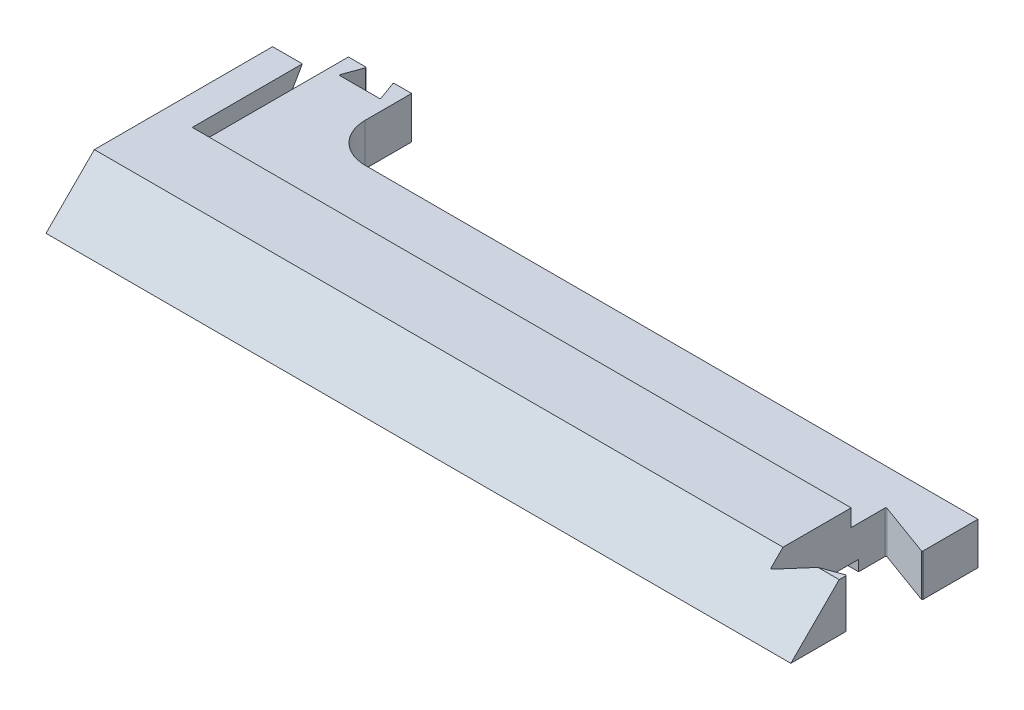
ISO-10303-21;
HEADER;
FILE_DESCRIPTION(('STEP AP214'),'2;1');
FILE_NAME('part.step','',(''),(''),'','','');
FILE_SCHEMA(('AUTOMOTIVE_DESIGN { 1 0 10303 214 1 1 1 1 }'));
ENDSEC;
DATA;
#1=APPLICATION_CONTEXT('core data for automotive mechanical design processes');
#2=APPLICATION_PROTOCOL_DEFINITION('international standard','automotive_design',2000,#1);
#3=PRODUCT_CONTEXT('',#1,'mechanical');
#4=PRODUCT('Part','Part','',(#3));
#5=PRODUCT_RELATED_PRODUCT_CATEGORY('part','',(#4));
#6=PRODUCT_DEFINITION_FORMATION('','',#4);
#7=PRODUCT_DEFINITION_CONTEXT('part definition',#1,'design');
#8=PRODUCT_DEFINITION('design','',#6,#7);
#9=PRODUCT_DEFINITION_SHAPE('','',#8);
#10=(LENGTH_UNIT() NAMED_UNIT(*) SI_UNIT(.MILLI.,.METRE.));
#11=(NAMED_UNIT(*) PLANE_ANGLE_UNIT() SI_UNIT($,.RADIAN.));
#12=(NAMED_UNIT(*) SI_UNIT($,.STERADIAN.) SOLID_ANGLE_UNIT());
#13=UNCERTAINTY_MEASURE_WITH_UNIT(LENGTH_MEASURE(1.E-05),#10,'distance_accuracy_value','');
#14=(GEOMETRIC_REPRESENTATION_CONTEXT(3) GLOBAL_UNCERTAINTY_ASSIGNED_CONTEXT((#13)) GLOBAL_UNIT_ASSIGNED_CONTEXT((#10,
#11,#12)) REPRESENTATION_CONTEXT('',''));
#15=CARTESIAN_POINT('',(0.,0.,0.));
#16=DIRECTION('',(0.,0.,1.));
#17=DIRECTION('',(1.,0.,0.));
#18=AXIS2_PLACEMENT_3D('',#15,#16,#17);
#19=CARTESIAN_POINT('',(-192.3375,0.,0.));
#20=DIRECTION('',(-1.,0.,0.));
#21=DIRECTION('',(0.,0.,1.));
#22=AXIS2_PLACEMENT_3D('',#19,#20,#21);
#23=PLANE('',#22);
#24=DIRECTION('',(0.,0.,1.));
#25=VECTOR('',#24,1.);
#26=CARTESIAN_POINT('',(-192.3375,11.31,-330.275));
#27=LINE('',#26,#25);
#28=CARTESIAN_POINT('',(-192.3375,11.31,-17.));
#29=VERTEX_POINT('',#28);
#30=CARTESIAN_POINT('',(-192.3375,11.31,-2.21687960134842));
#31=VERTEX_POINT('',#30);
#32=EDGE_CURVE('E290',#29,#31,#27,.T.);
#33=ORIENTED_EDGE('',*,*,#32,.T.);
#34=DIRECTION('',(0.,1.,0.));
#35=VECTOR('',#34,1.);
#36=CARTESIAN_POINT('',(-192.3375,0.,-2.2168796013484));
#37=LINE('',#36,#35);
#38=CARTESIAN_POINT('',(-192.3375,0.,-2.21687960134842));
#39=VERTEX_POINT('',#38);
#40=EDGE_CURVE('E59',#31,#39,#37,.F.);
#41=ORIENTED_EDGE('',*,*,#40,.T.);
#42=DIRECTION('',(0.,0.,1.));
#43=VECTOR('',#42,1.);
#44=CARTESIAN_POINT('',(-192.3375,0.,-330.275));
#45=LINE('',#44,#43);
#46=CARTESIAN_POINT('',(-192.3375,0.,-17.));
#47=VERTEX_POINT('',#46);
#48=EDGE_CURVE('E305',#47,#39,#45,.T.);
#49=ORIENTED_EDGE('',*,*,#48,.F.);
#50=DIRECTION('',(0.,1.,0.));
#51=VECTOR('',#50,1.);
#52=CARTESIAN_POINT('',(-192.3375,2.9,-17.));
#53=LINE('',#52,#51);
#54=EDGE_CURVE('E294',#47,#29,#53,.T.);
#55=ORIENTED_EDGE('',*,*,#54,.T.);
#56=EDGE_LOOP('',(#33,#41,#49,#55));
#57=FACE_BOUND('',#56,.T.);
#58=ADVANCED_FACE('F44',(#57),#23,.F.);
#59=CARTESIAN_POINT('',(0.,15.9,0.));
#60=DIRECTION('',(0.,1.,0.));
#61=DIRECTION('',(0.,0.,1.));
#62=AXIS2_PLACEMENT_3D('',#59,#60,#61);
#63=PLANE('',#62);
#64=DIRECTION('',(0.,0.,1.));
#65=VECTOR('',#64,1.);
#66=CARTESIAN_POINT('',(-192.3375,15.9,0.));
#67=LINE('',#66,#65);
#68=CARTESIAN_POINT('',(-192.3375,15.9,18.5543796013485));
#69=VERTEX_POINT('',#68);
#70=CARTESIAN_POINT('',(-192.3375,15.9,20.3375000000002));
#71=VERTEX_POINT('',#70);
#72=EDGE_CURVE('E299',#69,#71,#67,.T.);
#73=ORIENTED_EDGE('',*,*,#72,.F.);
#74=CARTESIAN_POINT('',(-192.5375,15.9,18.5543796013485));
#75=DIRECTION('',(0.,1.,0.));
#76=DIRECTION('',(0.,0.,1.));
#77=AXIS2_PLACEMENT_3D('',#74,#75,#76);
#78=CIRCLE('',#77,0.2);
#79=CARTESIAN_POINT('',(-192.605904028665,15.9,18.3664410771913));
#80=VERTEX_POINT('',#79);
#81=EDGE_CURVE('E355',#69,#80,#78,.T.);
#82=ORIENTED_EDGE('',*,*,#81,.T.);
#83=DIRECTION('',(0.939692620785909,0.,-0.342020143325666));
#84=VECTOR('',#83,1.);
#85=CARTESIAN_POINT('',(-16.627750388571,15.9,-45.684368728927));
#86=LINE('',#85,#84);
#87=CARTESIAN_POINT('',(-198.021343911497,15.9,20.3375000000002));
#88=VERTEX_POINT('',#87);
#89=EDGE_CURVE('E392',#88,#80,#86,.T.);
#90=ORIENTED_EDGE('',*,*,#89,.F.);
#91=DIRECTION('',(1.,0.,0.));
#92=VECTOR('',#91,1.);
#93=CARTESIAN_POINT('',(-392.675,15.9,20.3375000000002));
#94=LINE('',#93,#92);
#95=EDGE_CURVE('E425',#88,#71,#94,.T.);
#96=ORIENTED_EDGE('',*,*,#95,.T.);
#97=EDGE_LOOP('',(#73,#82,#90,#96));
#98=FACE_BOUND('',#97,.T.);
#99=ADVANCED_FACE('F508',(#98),#63,.T.);
#100=CARTESIAN_POINT('',(0.,0.,-40.));
#101=DIRECTION('',(0.,0.,1.));
#102=DIRECTION('',(1.,0.,0.));
#103=AXIS2_PLACEMENT_3D('',#100,#101,#102);
#104=PLANE('',#103);
#105=DIRECTION('',(1.,0.,0.));
#106=VECTOR('',#105,1.);
#107=CARTESIAN_POINT('',(-357.675,0.,-40.));
#108=LINE('',#107,#106);
#109=CARTESIAN_POINT('',(-372.289370398652,0.,-40.));
#110=VERTEX_POINT('',#109);
#111=CARTESIAN_POINT('',(-367.675,0.,-40.));
#112=VERTEX_POINT('',#111);
#113=EDGE_CURVE('E304',#110,#112,#108,.T.);
#114=ORIENTED_EDGE('',*,*,#113,.F.);
#115=DIRECTION('',(0.,1.,0.));
#116=VECTOR('',#115,1.);
#117=CARTESIAN_POINT('',(-372.289370398652,0.,-40.));
#118=LINE('',#117,#116);
#119=CARTESIAN_POINT('',(-372.289370398652,11.31,-40.));
#120=VERTEX_POINT('',#119);
#121=EDGE_CURVE('E325',#110,#120,#118,.T.);
#122=ORIENTED_EDGE('',*,*,#121,.T.);
#123=DIRECTION('',(1.,0.,0.));
#124=VECTOR('',#123,1.);
#125=CARTESIAN_POINT('',(-357.675,11.31,-40.));
#126=LINE('',#125,#124);
#127=CARTESIAN_POINT('',(-367.675,11.31,-40.));
#128=VERTEX_POINT('',#127);
#129=EDGE_CURVE('E292',#120,#128,#126,.T.);
#130=ORIENTED_EDGE('',*,*,#129,.T.);
#131=DIRECTION('',(0.,-1.,0.));
#132=VECTOR('',#131,1.);
#133=CARTESIAN_POINT('',(-367.675,2.9,-40.));
#134=LINE('',#133,#132);
#135=EDGE_CURVE('E297',#128,#112,#134,.T.);
#136=ORIENTED_EDGE('',*,*,#135,.T.);
#137=EDGE_LOOP('',(#114,#122,#130,#136));
#138=FACE_BOUND('',#137,.T.);
#139=ADVANCED_FACE('F515',(#138),#104,.F.);
#140=CARTESIAN_POINT('',(-384.675,11.31,-40.));
#141=VERTEX_POINT('',#140);
#142=CARTESIAN_POINT('',(-380.060629601348,11.31,-40.));
#143=VERTEX_POINT('',#142);
#144=EDGE_CURVE('E298',#141,#143,#126,.T.);
#145=ORIENTED_EDGE('',*,*,#144,.T.);
#146=DIRECTION('',(0.,1.,0.));
#147=VECTOR('',#146,1.);
#148=CARTESIAN_POINT('',(-380.060629601348,0.,-40.));
#149=LINE('',#148,#147);
#150=CARTESIAN_POINT('',(-380.060629601348,0.,-40.));
#151=VERTEX_POINT('',#150);
#152=EDGE_CURVE('E341',#143,#151,#149,.F.);
#153=ORIENTED_EDGE('',*,*,#152,.T.);
#154=CARTESIAN_POINT('',(-384.675,0.,-40.));
#155=VERTEX_POINT('',#154);
#156=EDGE_CURVE('E307',#155,#151,#108,.T.);
#157=ORIENTED_EDGE('',*,*,#156,.F.);
#158=DIRECTION('',(0.,-1.,0.));
#159=VECTOR('',#158,1.);
#160=CARTESIAN_POINT('',(-384.675,2.9,-40.));
#161=LINE('',#160,#159);
#162=EDGE_CURVE('E301',#141,#155,#161,.T.);
#163=ORIENTED_EDGE('',*,*,#162,.F.);
#164=EDGE_LOOP('',(#145,#153,#157,#163));
#165=FACE_BOUND('',#164,.T.);
#166=ADVANCED_FACE('F523',(#165),#104,.F.);
#167=DIRECTION('',(0.,0.,1.));
#168=VECTOR('',#167,1.);
#169=CARTESIAN_POINT('',(-192.3375,2.9,0.));
#170=LINE('',#169,#168);
#171=CARTESIAN_POINT('',(-192.3375,2.9,18.5543796013485));
#172=VERTEX_POINT('',#171);
#173=CARTESIAN_POINT('',(-192.3375,2.9,33.3375));
#174=VERTEX_POINT('',#173);
#175=EDGE_CURVE('E302',#172,#174,#170,.T.);
#176=ORIENTED_EDGE('',*,*,#175,.F.);
#177=DIRECTION('',(0.,1.,0.));
#178=VECTOR('',#177,1.);
#179=CARTESIAN_POINT('',(-192.3375,0.,18.5543796013485));
#180=LINE('',#179,#178);
#181=EDGE_CURVE('E352',#172,#69,#180,.T.);
#182=ORIENTED_EDGE('',*,*,#181,.T.);
#183=ORIENTED_EDGE('',*,*,#72,.T.);
#184=DIRECTION('',(0.,0.707106781186551,-0.707106781186544));
#185=VECTOR('',#184,1.);
#186=CARTESIAN_POINT('',(-192.3375,2.89999999999999,33.3375000000001));
#187=LINE('',#186,#185);
#188=EDGE_CURVE('E289',#174,#71,#187,.T.);
#189=ORIENTED_EDGE('',*,*,#188,.F.);
#190=EDGE_LOOP('',(#176,#182,#183,#189));
#191=FACE_BOUND('',#190,.T.);
#192=ADVANCED_FACE('F510',(#191),#23,.F.);
#193=CARTESIAN_POINT('',(-384.675,2.9,-20.1093093456041));
#194=DIRECTION('',(0.,0.500000000000004,0.866025403784436));
#195=DIRECTION('',(0.,-0.866025403784436,0.500000000000004));
#196=AXIS2_PLACEMENT_3D('',#193,#194,#195);
#197=PLANE('',#196);
#198=DIRECTION('',(0.,0.866025403784436,-0.500000000000004));
#199=VECTOR('',#198,1.);
#200=CARTESIAN_POINT('',(-392.675,2.9,-20.1093093456041));
#201=LINE('',#200,#199);
#202=CARTESIAN_POINT('',(-392.675,2.9,-20.1093093456041));
#203=VERTEX_POINT('',#202);
#204=CARTESIAN_POINT('',(-392.675,15.9,-27.6148628450694));
#205=VERTEX_POINT('',#204);
#206=EDGE_CURVE('E453',#203,#205,#201,.T.);
#207=ORIENTED_EDGE('',*,*,#206,.T.);
#208=DIRECTION('',(-1.,0.,0.));
#209=VECTOR('',#208,1.);
#210=CARTESIAN_POINT('',(-384.675,15.9,-27.6148628450694));
#211=LINE('',#210,#209);
#212=CARTESIAN_POINT('',(-384.675,15.9,-27.6148628450694));
#213=VERTEX_POINT('',#212);
#214=EDGE_CURVE('E433',#213,#205,#211,.T.);
#215=ORIENTED_EDGE('',*,*,#214,.F.);
#216=DIRECTION('',(0.,0.866025403784436,-0.500000000000004));
#217=VECTOR('',#216,1.);
#218=CARTESIAN_POINT('',(-384.675,2.9,-20.1093093456041));
#219=LINE('',#218,#217);
#220=CARTESIAN_POINT('',(-384.675,11.31,-24.9648251094889));
#221=VERTEX_POINT('',#220);
#222=EDGE_CURVE('E451',#221,#213,#219,.T.);
#223=ORIENTED_EDGE('',*,*,#222,.F.);
#224=CARTESIAN_POINT('',(-384.675,2.9,-20.1093093456041));
#225=VERTEX_POINT('',#224);
#226=EDGE_CURVE('E448',#225,#221,#219,.T.);
#227=ORIENTED_EDGE('',*,*,#226,.F.);
#228=DIRECTION('',(-1.,0.,0.));
#229=VECTOR('',#228,1.);
#230=CARTESIAN_POINT('',(-384.675,2.9,-20.1093093456041));
#231=LINE('',#230,#229);
#232=EDGE_CURVE('E452',#225,#203,#231,.T.);
#233=ORIENTED_EDGE('',*,*,#232,.T.);
#234=EDGE_LOOP('',(#207,#215,#223,#227,#233));
#235=FACE_BOUND('',#234,.T.);
#236=ADVANCED_FACE('F522',(#235),#197,.F.);
#237=CARTESIAN_POINT('',(-392.675,15.9,0.));
#238=DIRECTION('',(1.,0.,0.));
#239=DIRECTION('',(0.,0.,-1.));
#240=AXIS2_PLACEMENT_3D('',#237,#238,#239);
#241=PLANE('',#240);
#242=DIRECTION('',(0.,0.,1.));
#243=VECTOR('',#242,1.);
#244=CARTESIAN_POINT('',(-392.675,2.9,0.));
#245=LINE('',#244,#243);
#246=CARTESIAN_POINT('',(-392.675,2.9,33.3375));
#247=VERTEX_POINT('',#246);
#248=EDGE_CURVE('E428',#203,#247,#245,.T.);
#249=ORIENTED_EDGE('',*,*,#248,.T.);
#250=DIRECTION('',(0.,0.707106781186551,-0.707106781186544));
#251=VECTOR('',#250,1.);
#252=CARTESIAN_POINT('',(-392.675,2.9,33.3375000000001));
#253=LINE('',#252,#251);
#254=CARTESIAN_POINT('',(-392.675,15.9,20.3375000000002));
#255=VERTEX_POINT('',#254);
#256=EDGE_CURVE('E424',#247,#255,#253,.T.);
#257=ORIENTED_EDGE('',*,*,#256,.T.);
#258=DIRECTION('',(0.,0.,1.));
#259=VECTOR('',#258,1.);
#260=CARTESIAN_POINT('',(-392.675,15.9,0.));
#261=LINE('',#260,#259);
#262=EDGE_CURVE('E429',#205,#255,#261,.T.);
#263=ORIENTED_EDGE('',*,*,#262,.F.);
#264=ORIENTED_EDGE('',*,*,#206,.F.);
#265=EDGE_LOOP('',(#249,#257,#263,#264));
#266=FACE_BOUND('',#265,.T.);
#267=ADVANCED_FACE('F529',(#266),#241,.F.);
#268=CARTESIAN_POINT('',(-367.675,2.9,-17.));
#269=DIRECTION('',(1.,0.,0.));
#270=DIRECTION('',(0.,0.,-1.));
#271=AXIS2_PLACEMENT_3D('',#268,#269,#270);
#272=PLANE('',#271);
#273=ORIENTED_EDGE('',*,*,#135,.F.);
#274=DIRECTION('',(0.,0.,1.));
#275=VECTOR('',#274,1.);
#276=CARTESIAN_POINT('',(-367.675,11.31,-17.));
#277=LINE('',#276,#275);
#278=CARTESIAN_POINT('',(-367.675,11.31,-27.5));
#279=VERTEX_POINT('',#278);
#280=EDGE_CURVE('E413',#128,#279,#277,.T.);
#281=ORIENTED_EDGE('',*,*,#280,.T.);
#282=DIRECTION('',(0.,-1.,0.));
#283=VECTOR('',#282,1.);
#284=CARTESIAN_POINT('',(-367.675,0.,-27.5));
#285=LINE('',#284,#283);
#286=CARTESIAN_POINT('',(-367.675,0.,-27.5));
#287=VERTEX_POINT('',#286);
#288=EDGE_CURVE('E458',#279,#287,#285,.T.);
#289=ORIENTED_EDGE('',*,*,#288,.T.);
#290=DIRECTION('',(0.,0.,1.));
#291=VECTOR('',#290,1.);
#292=CARTESIAN_POINT('',(-367.675,0.,-17.));
#293=LINE('',#292,#291);
#294=EDGE_CURVE('E277',#112,#287,#293,.T.);
#295=ORIENTED_EDGE('',*,*,#294,.F.);
#296=EDGE_LOOP('',(#273,#281,#289,#295));
#297=FACE_BOUND('',#296,.T.);
#298=ADVANCED_FACE('F550',(#297),#272,.T.);
#299=CARTESIAN_POINT('',(-357.175,2.9,-27.5));
#300=DIRECTION('',(0.,1.,0.));
#301=DIRECTION('',(0.,0.,1.));
#302=AXIS2_PLACEMENT_3D('',#299,#300,#301);
#303=CYLINDRICAL_SURFACE('',#302,10.5);
#304=CARTESIAN_POINT('',(-357.175,11.31,-27.5));
#305=DIRECTION('',(0.,1.,0.));
#306=DIRECTION('',(0.,0.,1.));
#307=AXIS2_PLACEMENT_3D('',#304,#305,#306);
#308=CIRCLE('',#307,10.5);
#309=CARTESIAN_POINT('',(-357.175,11.31,-17.));
#310=VERTEX_POINT('',#309);
#311=EDGE_CURVE('E420',#310,#279,#308,.F.);
#312=ORIENTED_EDGE('',*,*,#311,.F.);
#313=DIRECTION('',(0.,-1.,0.));
#314=VECTOR('',#313,1.);
#315=CARTESIAN_POINT('',(-357.175,2.9,-17.));
#316=LINE('',#315,#314);
#317=CARTESIAN_POINT('',(-357.175,0.,-17.));
#318=VERTEX_POINT('',#317);
#319=EDGE_CURVE('E461',#318,#310,#316,.F.);
#320=ORIENTED_EDGE('',*,*,#319,.F.);
#321=CARTESIAN_POINT('',(-357.175,0.,-27.5));
#322=DIRECTION('',(0.,1.,0.));
#323=DIRECTION('',(0.,0.,1.));
#324=AXIS2_PLACEMENT_3D('',#321,#322,#323);
#325=CIRCLE('',#324,10.5);
#326=EDGE_CURVE('E288',#287,#318,#325,.T.);
#327=ORIENTED_EDGE('',*,*,#326,.F.);
#328=ORIENTED_EDGE('',*,*,#288,.F.);
#329=EDGE_LOOP('',(#312,#320,#327,#328));
#330=FACE_BOUND('',#329,.T.);
#331=ADVANCED_FACE('F553',(#330),#303,.F.);
#332=CARTESIAN_POINT('',(-367.675,2.9,-17.));
#333=DIRECTION('',(0.,0.,-1.));
#334=DIRECTION('',(-1.,0.,0.));
#335=AXIS2_PLACEMENT_3D('',#332,#333,#334);
#336=PLANE('',#335);
#337=ORIENTED_EDGE('',*,*,#54,.F.);
#338=DIRECTION('',(1.,0.,0.));
#339=VECTOR('',#338,1.);
#340=CARTESIAN_POINT('',(-367.675,0.,-17.));
#341=LINE('',#340,#339);
#342=EDGE_CURVE('E273',#318,#47,#341,.T.);
#343=ORIENTED_EDGE('',*,*,#342,.F.);
#344=ORIENTED_EDGE('',*,*,#319,.T.);
#345=DIRECTION('',(1.,0.,0.));
#346=VECTOR('',#345,1.);
#347=CARTESIAN_POINT('',(-367.675,11.31,-17.));
#348=LINE('',#347,#346);
#349=EDGE_CURVE('E417',#310,#29,#348,.T.);
#350=ORIENTED_EDGE('',*,*,#349,.T.);
#351=EDGE_LOOP('',(#337,#343,#344,#350));
#352=FACE_BOUND('',#351,.T.);
#353=ADVANCED_FACE('F559',(#352),#336,.T.);
#354=CARTESIAN_POINT('',(-384.675,2.9,0.));
#355=DIRECTION('',(1.,0.,0.));
#356=DIRECTION('',(0.,0.,-1.));
#357=AXIS2_PLACEMENT_3D('',#354,#355,#356);
#358=PLANE('',#357);
#359=DIRECTION('',(0.,0.,-1.));
#360=VECTOR('',#359,1.);
#361=CARTESIAN_POINT('',(-384.675,11.31,0.));
#362=LINE('',#361,#360);
#363=EDGE_CURVE('E317',#221,#141,#362,.T.);
#364=ORIENTED_EDGE('',*,*,#363,.T.);
#365=ORIENTED_EDGE('',*,*,#162,.T.);
#366=DIRECTION('',(0.,0.,1.));
#367=VECTOR('',#366,1.);
#368=CARTESIAN_POINT('',(-384.675,0.,0.));
#369=LINE('',#368,#367);
#370=CARTESIAN_POINT('',(-384.675,0.,0.));
#371=VERTEX_POINT('',#370);
#372=EDGE_CURVE('E274',#155,#371,#369,.T.);
#373=ORIENTED_EDGE('',*,*,#372,.T.);
#374=DIRECTION('',(0.,-1.,0.));
#375=VECTOR('',#374,1.);
#376=CARTESIAN_POINT('',(-384.675,2.9,0.));
#377=LINE('',#376,#375);
#378=CARTESIAN_POINT('',(-384.675,2.9,0.));
#379=VERTEX_POINT('',#378);
#380=EDGE_CURVE('E272',#379,#371,#377,.T.);
#381=ORIENTED_EDGE('',*,*,#380,.F.);
#382=DIRECTION('',(0.,0.,1.));
#383=VECTOR('',#382,1.);
#384=CARTESIAN_POINT('',(-384.675,2.9,0.));
#385=LINE('',#384,#383);
#386=EDGE_CURVE('E284',#225,#379,#385,.T.);
#387=ORIENTED_EDGE('',*,*,#386,.F.);
#388=ORIENTED_EDGE('',*,*,#226,.T.);
#389=EDGE_LOOP('',(#364,#365,#373,#381,#387,#388));
#390=FACE_BOUND('',#389,.T.);
#391=ADVANCED_FACE('F555',(#390),#358,.F.);
#392=CARTESIAN_POINT('',(-384.675,15.900012,0.));
#393=DIRECTION('',(-1.,0.,0.));
#394=DIRECTION('',(0.,0.,1.));
#395=AXIS2_PLACEMENT_3D('',#392,#393,#394);
#396=PLANE('',#395);
#397=DIRECTION('',(0.,0.,1.));
#398=VECTOR('',#397,1.);
#399=CARTESIAN_POINT('',(-384.675,15.9,0.));
#400=LINE('',#399,#398);
#401=CARTESIAN_POINT('',(-384.675,15.9,2.0000000000001));
#402=VERTEX_POINT('',#401);
#403=EDGE_CURVE('E421',#213,#402,#400,.T.);
#404=ORIENTED_EDGE('',*,*,#403,.T.);
#405=DIRECTION('',(0.,-1.,0.));
#406=VECTOR('',#405,1.);
#407=CARTESIAN_POINT('',(-384.675,15.900012,2.0000000000001));
#408=LINE('',#407,#406);
#409=CARTESIAN_POINT('',(-384.675,11.31,2.0000000000001));
#410=VERTEX_POINT('',#409);
#411=EDGE_CURVE('E410',#402,#410,#408,.T.);
#412=ORIENTED_EDGE('',*,*,#411,.T.);
#413=EDGE_CURVE('E409',#410,#221,#362,.T.);
#414=ORIENTED_EDGE('',*,*,#413,.T.);
#415=ORIENTED_EDGE('',*,*,#222,.T.);
#416=EDGE_LOOP('',(#404,#412,#414,#415));
#417=FACE_BOUND('',#416,.T.);
#418=ADVANCED_FACE('F558',(#417),#396,.F.);
#419=CARTESIAN_POINT('',(-357.675,11.31,-330.275));
#420=DIRECTION('',(0.,1.,0.));
#421=DIRECTION('',(0.,0.,1.));
#422=AXIS2_PLACEMENT_3D('',#419,#420,#421);
#423=PLANE('',#422);
#424=DIRECTION('',(-0.939692620785907,0.,-0.342020143325673));
#425=VECTOR('',#424,1.);
#426=CARTESIAN_POINT('',(-443.8618336661,11.31,-93.478620648102));
#427=LINE('',#426,#425);
#428=CARTESIAN_POINT('',(-192.605904028665,11.31,-2.02894107719118));
#429=VERTEX_POINT('',#428);
#430=CARTESIAN_POINT('',(-207.180221778335,11.31,-7.33355892280875));
#431=VERTEX_POINT('',#430);
#432=EDGE_CURVE('E383',#429,#431,#427,.T.);
#433=ORIENTED_EDGE('',*,*,#432,.F.);
#434=CARTESIAN_POINT('',(-192.5375,11.31,-2.2168796013484));
#435=DIRECTION('',(0.,1.,0.));
#436=DIRECTION('',(0.,0.,1.));
#437=AXIS2_PLACEMENT_3D('',#434,#435,#436);
#438=CIRCLE('',#437,0.2);
#439=EDGE_CURVE('E67',#429,#31,#438,.T.);
#440=ORIENTED_EDGE('',*,*,#439,.T.);
#441=ORIENTED_EDGE('',*,*,#32,.F.);
#442=ORIENTED_EDGE('',*,*,#349,.F.);
#443=ORIENTED_EDGE('',*,*,#311,.T.);
#444=ORIENTED_EDGE('',*,*,#280,.F.);
#445=ORIENTED_EDGE('',*,*,#129,.F.);
#446=CARTESIAN_POINT('',(-372.289370398652,11.31,-39.8));
#447=DIRECTION('',(0.,1.,0.));
#448=DIRECTION('',(0.,0.,1.));
#449=AXIS2_PLACEMENT_3D('',#446,#447,#448);
#450=CIRCLE('',#449,0.2);
#451=CARTESIAN_POINT('',(-372.477308922809,11.31,-39.7315959713348));
#452=VERTEX_POINT('',#451);
#453=EDGE_CURVE('E330',#120,#452,#450,.T.);
#454=ORIENTED_EDGE('',*,*,#453,.T.);
#455=DIRECTION('',(-0.342020143325672,0.,-0.939692620785907));
#456=VECTOR('',#455,1.);
#457=CARTESIAN_POINT('',(-464.124617802117,11.31,-291.530507671015));
#458=LINE('',#457,#456);
#459=CARTESIAN_POINT('',(-370.672691077191,11.31,-34.7734491897558));
#460=VERTEX_POINT('',#459);
#461=EDGE_CURVE('E293',#460,#452,#458,.T.);
#462=ORIENTED_EDGE('',*,*,#461,.F.);
#463=CARTESIAN_POINT('',(-370.860629601348,11.31,-34.7050451610908));
#464=DIRECTION('',(0.,1.,0.));
#465=DIRECTION('',(0.,0.,1.));
#466=AXIS2_PLACEMENT_3D('',#463,#464,#465);
#467=CIRCLE('',#466,0.2);
#468=CARTESIAN_POINT('',(-370.860629601348,11.31,-34.5050451610908));
#469=VERTEX_POINT('',#468);
#470=EDGE_CURVE('E343',#460,#469,#467,.F.);
#471=ORIENTED_EDGE('',*,*,#470,.T.);
#472=DIRECTION('',(1.,0.,0.));
#473=VECTOR('',#472,1.);
#474=CARTESIAN_POINT('',(-357.675,11.31,-34.5050451610908));
#475=LINE('',#474,#473);
#476=CARTESIAN_POINT('',(-381.489370398652,11.31,-34.5050451610908));
#477=VERTEX_POINT('',#476);
#478=EDGE_CURVE('E471',#477,#469,#475,.T.);
#479=ORIENTED_EDGE('',*,*,#478,.F.);
#480=CARTESIAN_POINT('',(-381.489370398652,11.31,-34.7050451610908));
#481=DIRECTION('',(0.,1.,0.));
#482=DIRECTION('',(0.,0.,1.));
#483=AXIS2_PLACEMENT_3D('',#480,#481,#482);
#484=CIRCLE('',#483,0.2);
#485=CARTESIAN_POINT('',(-381.677308922809,11.31,-34.7734491897558));
#486=VERTEX_POINT('',#485);
#487=EDGE_CURVE('E347',#477,#486,#484,.F.);
#488=ORIENTED_EDGE('',*,*,#487,.T.);
#489=DIRECTION('',(-0.342020143325672,0.,0.939692620785907));
#490=VECTOR('',#489,1.);
#491=CARTESIAN_POINT('',(-283.897204395584,11.31,-303.422078450216));
#492=LINE('',#491,#490);
#493=CARTESIAN_POINT('',(-379.872691077191,11.31,-39.7315959713349));
#494=VERTEX_POINT('',#493);
#495=EDGE_CURVE('E474',#494,#486,#492,.T.);
#496=ORIENTED_EDGE('',*,*,#495,.F.);
#497=CARTESIAN_POINT('',(-380.060629601348,11.31,-39.8));
#498=DIRECTION('',(0.,1.,0.));
#499=DIRECTION('',(0.,0.,1.));
#500=AXIS2_PLACEMENT_3D('',#497,#498,#499);
#501=CIRCLE('',#500,0.2);
#502=EDGE_CURVE('E328',#494,#143,#501,.T.);
#503=ORIENTED_EDGE('',*,*,#502,.T.);
#504=ORIENTED_EDGE('',*,*,#144,.F.);
#505=ORIENTED_EDGE('',*,*,#363,.F.);
#506=ORIENTED_EDGE('',*,*,#413,.F.);
#507=DIRECTION('',(-1.,0.,0.));
#508=VECTOR('',#507,1.);
#509=CARTESIAN_POINT('',(0.,11.31,2.00000000000006));
#510=LINE('',#509,#508);
#511=CARTESIAN_POINT('',(-207.448625807,11.31,2.00000000000008));
#512=VERTEX_POINT('',#511);
#513=EDGE_CURVE('E402',#512,#410,#510,.T.);
#514=ORIENTED_EDGE('',*,*,#513,.F.);
#515=DIRECTION('',(0.,0.,1.));
#516=VECTOR('',#515,1.);
#517=CARTESIAN_POINT('',(-207.448625807,11.31,-330.275));
#518=LINE('',#517,#516);
#519=CARTESIAN_POINT('',(-207.448625807,11.31,-7.14562039865157));
#520=VERTEX_POINT('',#519);
#521=EDGE_CURVE('E385',#520,#512,#518,.T.);
#522=ORIENTED_EDGE('',*,*,#521,.F.);
#523=CARTESIAN_POINT('',(-207.248625807,11.31,-7.1456203986516));
#524=DIRECTION('',(0.,1.,0.));
#525=DIRECTION('',(0.,0.,1.));
#526=AXIS2_PLACEMENT_3D('',#523,#524,#525);
#527=CIRCLE('',#526,0.2);
#528=EDGE_CURVE('E52',#520,#431,#527,.F.);
#529=ORIENTED_EDGE('',*,*,#528,.T.);
#530=EDGE_LOOP('',(#433,#440,#441,#442,#443,#444,#445,#454,#462,#471,#479,#488,#496,#503,#504,
#505,#506,#514,#522,#529));
#531=FACE_BOUND('',#530,.T.);
#532=ADVANCED_FACE('F382',(#531),#423,.T.);
#533=DIRECTION('',(0.,0.,1.));
#534=VECTOR('',#533,1.);
#535=CARTESIAN_POINT('',(-207.448625807,15.9,0.));
#536=LINE('',#535,#534);
#537=CARTESIAN_POINT('',(-207.448625807,15.9,2.00000000000009));
#538=VERTEX_POINT('',#537);
#539=CARTESIAN_POINT('',(-207.448625807,15.9,20.3375000000002));
#540=VERTEX_POINT('',#539);
#541=EDGE_CURVE('E405',#538,#540,#536,.T.);
#542=ORIENTED_EDGE('',*,*,#541,.F.);
#543=DIRECTION('',(1.,0.,0.));
#544=VECTOR('',#543,1.);
#545=CARTESIAN_POINT('',(0.,15.9,2.00000000000006));
#546=LINE('',#545,#544);
#547=EDGE_CURVE('E285',#402,#538,#546,.T.);
#548=ORIENTED_EDGE('',*,*,#547,.F.);
#549=ORIENTED_EDGE('',*,*,#403,.F.);
#550=ORIENTED_EDGE('',*,*,#214,.T.);
#551=ORIENTED_EDGE('',*,*,#262,.T.);
#552=EDGE_CURVE('E422',#255,#540,#94,.T.);
#553=ORIENTED_EDGE('',*,*,#552,.T.);
#554=EDGE_LOOP('',(#542,#548,#549,#550,#551,#553));
#555=FACE_BOUND('',#554,.T.);
#556=ADVANCED_FACE('F518',(#555),#63,.T.);
#557=CARTESIAN_POINT('',(0.,15.900012,2.00000000000006));
#558=DIRECTION('',(0.,0.,1.));
#559=DIRECTION('',(1.,0.,0.));
#560=AXIS2_PLACEMENT_3D('',#557,#558,#559);
#561=PLANE('',#560);
#562=ORIENTED_EDGE('',*,*,#547,.T.);
#563=DIRECTION('',(0.,-1.,0.));
#564=VECTOR('',#563,1.);
#565=CARTESIAN_POINT('',(-207.448625807,15.900012,2.00000000000008));
#566=LINE('',#565,#564);
#567=EDGE_CURVE('E396',#538,#512,#566,.T.);
#568=ORIENTED_EDGE('',*,*,#567,.T.);
#569=ORIENTED_EDGE('',*,*,#513,.T.);
#570=ORIENTED_EDGE('',*,*,#411,.F.);
#571=EDGE_LOOP('',(#562,#568,#569,#570));
#572=FACE_BOUND('',#571,.T.);
#573=ADVANCED_FACE('F400',(#572),#561,.F.);
#574=CARTESIAN_POINT('',(0.,2.9,0.));
#575=DIRECTION('',(0.,1.,0.));
#576=DIRECTION('',(0.,0.,1.));
#577=AXIS2_PLACEMENT_3D('',#574,#575,#576);
#578=PLANE('',#577);
#579=DIRECTION('',(0.939692620785909,0.,-0.342020143325666));
#580=VECTOR('',#579,1.);
#581=CARTESIAN_POINT('',(-16.627750388571,2.9,-45.684368728927));
#582=LINE('',#581,#580);
#583=CARTESIAN_POINT('',(-207.180221778335,2.9,23.6710589228087));
#584=VERTEX_POINT('',#583);
#585=CARTESIAN_POINT('',(-192.605904028665,2.9,18.3664410771913));
#586=VERTEX_POINT('',#585);
#587=EDGE_CURVE('E486',#584,#586,#582,.T.);
#588=ORIENTED_EDGE('',*,*,#587,.T.);
#589=CARTESIAN_POINT('',(-192.5375,2.9,18.5543796013485));
#590=DIRECTION('',(0.,1.,0.));
#591=DIRECTION('',(0.,0.,1.));
#592=AXIS2_PLACEMENT_3D('',#589,#590,#591);
#593=CIRCLE('',#592,0.2);
#594=EDGE_CURVE('E362',#586,#172,#593,.F.);
#595=ORIENTED_EDGE('',*,*,#594,.T.);
#596=ORIENTED_EDGE('',*,*,#175,.T.);
#597=DIRECTION('',(1.,0.,0.));
#598=VECTOR('',#597,1.);
#599=CARTESIAN_POINT('',(0.,2.9,33.3375));
#600=LINE('',#599,#598);
#601=EDGE_CURVE('E426',#247,#174,#600,.T.);
#602=ORIENTED_EDGE('',*,*,#601,.F.);
#603=ORIENTED_EDGE('',*,*,#248,.F.);
#604=ORIENTED_EDGE('',*,*,#232,.F.);
#605=ORIENTED_EDGE('',*,*,#386,.T.);
#606=DIRECTION('',(1.,0.,0.));
#607=VECTOR('',#606,1.);
#608=CARTESIAN_POINT('',(0.,2.9,0.));
#609=LINE('',#608,#607);
#610=CARTESIAN_POINT('',(-207.448625807,2.9,0.));
#611=VERTEX_POINT('',#610);
#612=EDGE_CURVE('E279',#379,#611,#609,.T.);
#613=ORIENTED_EDGE('',*,*,#612,.T.);
#614=DIRECTION('',(0.,0.,1.));
#615=VECTOR('',#614,1.);
#616=CARTESIAN_POINT('',(-207.448625807,2.9,0.));
#617=LINE('',#616,#615);
#618=CARTESIAN_POINT('',(-207.448625807,2.9,23.4831203986516));
#619=VERTEX_POINT('',#618);
#620=EDGE_CURVE('E255',#611,#619,#617,.T.);
#621=ORIENTED_EDGE('',*,*,#620,.T.);
#622=CARTESIAN_POINT('',(-207.248625807,2.9,23.4831203986516));
#623=DIRECTION('',(0.,1.,0.));
#624=DIRECTION('',(0.,0.,1.));
#625=AXIS2_PLACEMENT_3D('',#622,#623,#624);
#626=CIRCLE('',#625,0.2);
#627=EDGE_CURVE('E379',#619,#584,#626,.T.);
#628=ORIENTED_EDGE('',*,*,#627,.T.);
#629=EDGE_LOOP('',(#588,#595,#596,#602,#603,#604,#605,#613,#621,#628));
#630=FACE_BOUND('',#629,.T.);
#631=ADVANCED_FACE('F590',(#630),#578,.F.);
#632=CARTESIAN_POINT('',(-392.675,2.9,33.3375000000001));
#633=DIRECTION('',(0.,-0.707106781186544,-0.707106781186551));
#634=DIRECTION('',(0.,0.707106781186551,-0.707106781186544));
#635=AXIS2_PLACEMENT_3D('',#632,#633,#634);
#636=PLANE('',#635);
#637=ORIENTED_EDGE('',*,*,#95,.F.);
#638=DIRECTION('',(-0.889126490715989,-0.323615577118185,0.323615577118182));
#639=VECTOR('',#638,1.);
#640=CARTESIAN_POINT('',(-359.385111605709,-42.8316083297395,79.0691083297391));
#641=LINE('',#640,#639);
#642=CARTESIAN_POINT('',(-207.180221778335,12.5664410771914,23.6710589228087));
#643=VERTEX_POINT('',#642);
#644=EDGE_CURVE('E266',#88,#643,#641,.T.);
#645=ORIENTED_EDGE('',*,*,#644,.T.);
#646=CARTESIAN_POINT('',(-207.248625807,12.7543796013486,23.4831203986516));
#647=DIRECTION('',(0.,-0.707106781186544,-0.707106781186551));
#648=DIRECTION('',(0.,-0.707106781186551,0.707106781186544));
#649=AXIS2_PLACEMENT_3D('',#646,#647,#648);
#650=ELLIPSE('',#649,0.282842712474621,0.2);
#651=CARTESIAN_POINT('',(-207.448625807,12.7543796013486,23.4831203986516));
#652=VERTEX_POINT('',#651);
#653=EDGE_CURVE('E377',#643,#652,#650,.T.);
#654=ORIENTED_EDGE('',*,*,#653,.T.);
#655=DIRECTION('',(0.,0.707106781186551,-0.707106781186544));
#656=VECTOR('',#655,1.);
#657=CARTESIAN_POINT('',(-207.448625807,2.89999999999999,33.3375000000001));
#658=LINE('',#657,#656);
#659=EDGE_CURVE('E492',#652,#540,#658,.T.);
#660=ORIENTED_EDGE('',*,*,#659,.T.);
#661=ORIENTED_EDGE('',*,*,#552,.F.);
#662=ORIENTED_EDGE('',*,*,#256,.F.);
#663=ORIENTED_EDGE('',*,*,#601,.T.);
#664=ORIENTED_EDGE('',*,*,#188,.T.);
#665=EDGE_LOOP('',(#637,#645,#654,#660,#661,#662,#663,#664));
#666=FACE_BOUND('',#665,.T.);
#667=ADVANCED_FACE('F545',(#666),#636,.F.);
#668=CARTESIAN_POINT('',(-357.675,0.,-330.275));
#669=DIRECTION('',(0.,1.,0.));
#670=DIRECTION('',(0.,0.,1.));
#671=AXIS2_PLACEMENT_3D('',#668,#669,#670);
#672=PLANE('',#671);
#673=ORIENTED_EDGE('',*,*,#48,.T.);
#674=CARTESIAN_POINT('',(-192.5375,0.,-2.2168796013484));
#675=DIRECTION('',(0.,1.,0.));
#676=DIRECTION('',(0.,0.,1.));
#677=AXIS2_PLACEMENT_3D('',#674,#675,#676);
#678=CIRCLE('',#677,0.2);
#679=CARTESIAN_POINT('',(-192.605904028665,0.,-2.02894107719122));
#680=VERTEX_POINT('',#679);
#681=EDGE_CURVE('E375',#39,#680,#678,.F.);
#682=ORIENTED_EDGE('',*,*,#681,.T.);
#683=DIRECTION('',(-0.939692620785907,0.,-0.342020143325673));
#684=VECTOR('',#683,1.);
#685=CARTESIAN_POINT('',(-192.3375,0.,-1.93124999999997));
#686=LINE('',#685,#684);
#687=CARTESIAN_POINT('',(-207.180221778335,0.,-7.33355892280878));
#688=VERTEX_POINT('',#687);
#689=EDGE_CURVE('E256',#680,#688,#686,.T.);
#690=ORIENTED_EDGE('',*,*,#689,.T.);
#691=CARTESIAN_POINT('',(-207.248625807,0.,-7.1456203986516));
#692=DIRECTION('',(0.,1.,0.));
#693=DIRECTION('',(0.,0.,1.));
#694=AXIS2_PLACEMENT_3D('',#691,#692,#693);
#695=CIRCLE('',#694,0.2);
#696=CARTESIAN_POINT('',(-207.448625807,0.,-7.1456203986516));
#697=VERTEX_POINT('',#696);
#698=EDGE_CURVE('E11',#688,#697,#695,.T.);
#699=ORIENTED_EDGE('',*,*,#698,.T.);
#700=DIRECTION('',(0.,0.,1.));
#701=VECTOR('',#700,1.);
#702=CARTESIAN_POINT('',(-207.448625807,0.,-7.43125000000003));
#703=LINE('',#702,#701);
#704=CARTESIAN_POINT('',(-207.448625807,0.,0.));
#705=VERTEX_POINT('',#704);
#706=EDGE_CURVE('E244',#697,#705,#703,.T.);
#707=ORIENTED_EDGE('',*,*,#706,.T.);
#708=DIRECTION('',(1.,0.,0.));
#709=VECTOR('',#708,1.);
#710=CARTESIAN_POINT('',(0.,0.,0.));
#711=LINE('',#710,#709);
#712=EDGE_CURVE('E249',#371,#705,#711,.T.);
#713=ORIENTED_EDGE('',*,*,#712,.F.);
#714=ORIENTED_EDGE('',*,*,#372,.F.);
#715=ORIENTED_EDGE('',*,*,#156,.T.);
#716=CARTESIAN_POINT('',(-380.060629601348,0.,-39.8));
#717=DIRECTION('',(0.,1.,0.));
#718=DIRECTION('',(0.,0.,1.));
#719=AXIS2_PLACEMENT_3D('',#716,#717,#718);
#720=CIRCLE('',#719,0.2);
#721=CARTESIAN_POINT('',(-379.872691077191,0.,-39.7315959713349));
#722=VERTEX_POINT('',#721);
#723=EDGE_CURVE('E332',#151,#722,#720,.F.);
#724=ORIENTED_EDGE('',*,*,#723,.T.);
#725=DIRECTION('',(-0.342020143325672,0.,0.939692620785907));
#726=VECTOR('',#725,1.);
#727=CARTESIAN_POINT('',(-379.775,0.,-40.));
#728=LINE('',#727,#726);
#729=CARTESIAN_POINT('',(-381.677308922809,0.,-34.7734491897559));
#730=VERTEX_POINT('',#729);
#731=EDGE_CURVE('E483',#722,#730,#728,.T.);
#732=ORIENTED_EDGE('',*,*,#731,.T.);
#733=CARTESIAN_POINT('',(-381.489370398652,0.,-34.7050451610908));
#734=DIRECTION('',(0.,1.,0.));
#735=DIRECTION('',(0.,0.,1.));
#736=AXIS2_PLACEMENT_3D('',#733,#734,#735);
#737=CIRCLE('',#736,0.2);
#738=CARTESIAN_POINT('',(-381.489370398652,0.,-34.5050451610908));
#739=VERTEX_POINT('',#738);
#740=EDGE_CURVE('E267',#730,#739,#737,.T.);
#741=ORIENTED_EDGE('',*,*,#740,.T.);
#742=DIRECTION('',(1.,0.,0.));
#743=VECTOR('',#742,1.);
#744=CARTESIAN_POINT('',(-381.775,0.,-34.5050451610908));
#745=LINE('',#744,#743);
#746=CARTESIAN_POINT('',(-370.860629601348,0.,-34.5050451610908));
#747=VERTEX_POINT('',#746);
#748=EDGE_CURVE('E480',#739,#747,#745,.T.);
#749=ORIENTED_EDGE('',*,*,#748,.T.);
#750=CARTESIAN_POINT('',(-370.860629601348,0.,-34.7050451610908));
#751=DIRECTION('',(0.,1.,0.));
#752=DIRECTION('',(0.,0.,1.));
#753=AXIS2_PLACEMENT_3D('',#750,#751,#752);
#754=CIRCLE('',#753,0.2);
#755=CARTESIAN_POINT('',(-370.672691077191,0.,-34.7734491897559));
#756=VERTEX_POINT('',#755);
#757=EDGE_CURVE('E345',#747,#756,#754,.T.);
#758=ORIENTED_EDGE('',*,*,#757,.T.);
#759=DIRECTION('',(-0.342020143325672,0.,-0.939692620785907));
#760=VECTOR('',#759,1.);
#761=CARTESIAN_POINT('',(-370.575,0.,-34.5050451610908));
#762=LINE('',#761,#760);
#763=CARTESIAN_POINT('',(-372.477308922809,0.,-39.7315959713349));
#764=VERTEX_POINT('',#763);
#765=EDGE_CURVE('E477',#756,#764,#762,.T.);
#766=ORIENTED_EDGE('',*,*,#765,.T.);
#767=CARTESIAN_POINT('',(-372.289370398652,0.,-39.8));
#768=DIRECTION('',(0.,1.,0.));
#769=DIRECTION('',(0.,0.,1.));
#770=AXIS2_PLACEMENT_3D('',#767,#768,#769);
#771=CIRCLE('',#770,0.2);
#772=EDGE_CURVE('E334',#764,#110,#771,.F.);
#773=ORIENTED_EDGE('',*,*,#772,.T.);
#774=ORIENTED_EDGE('',*,*,#113,.T.);
#775=ORIENTED_EDGE('',*,*,#294,.T.);
#776=ORIENTED_EDGE('',*,*,#326,.T.);
#777=ORIENTED_EDGE('',*,*,#342,.T.);
#778=EDGE_LOOP('',(#673,#682,#690,#699,#707,#713,#714,#715,#724,#732,#741,#749,#758,#766,#773,
#774,#775,#776,#777));
#779=FACE_BOUND('',#778,.T.);
#780=ADVANCED_FACE('F246',(#779),#672,.F.);
#781=CARTESIAN_POINT('',(0.,2.9,0.));
#782=DIRECTION('',(0.,0.,-1.));
#783=DIRECTION('',(-1.,0.,0.));
#784=AXIS2_PLACEMENT_3D('',#781,#782,#783);
#785=PLANE('',#784);
#786=ORIENTED_EDGE('',*,*,#712,.T.);
#787=DIRECTION('',(0.,1.,0.));
#788=VECTOR('',#787,1.);
#789=CARTESIAN_POINT('',(-207.448625807,2.9,0.));
#790=LINE('',#789,#788);
#791=EDGE_CURVE('E259',#705,#611,#790,.T.);
#792=ORIENTED_EDGE('',*,*,#791,.T.);
#793=ORIENTED_EDGE('',*,*,#612,.F.);
#794=ORIENTED_EDGE('',*,*,#380,.T.);
#795=EDGE_LOOP('',(#786,#792,#793,#794));
#796=FACE_BOUND('',#795,.T.);
#797=ADVANCED_FACE('F270',(#796),#785,.F.);
#798=CARTESIAN_POINT('',(-370.575,0.,-34.5050451610908));
#799=DIRECTION('',(0.939692620785907,0.,-0.342020143325672));
#800=DIRECTION('',(-0.342020143325672,0.,-0.939692620785907));
#801=AXIS2_PLACEMENT_3D('',#798,#799,#800);
#802=PLANE('',#801);
#803=ORIENTED_EDGE('',*,*,#765,.F.);
#804=DIRECTION('',(0.,1.,0.));
#805=VECTOR('',#804,1.);
#806=CARTESIAN_POINT('',(-370.672691077191,11.31,-34.7734491897559));
#807=LINE('',#806,#805);
#808=EDGE_CURVE('E316',#756,#460,#807,.T.);
#809=ORIENTED_EDGE('',*,*,#808,.T.);
#810=ORIENTED_EDGE('',*,*,#461,.T.);
#811=DIRECTION('',(0.,1.,0.));
#812=VECTOR('',#811,1.);
#813=CARTESIAN_POINT('',(-372.477308922809,0.,-39.7315959713349));
#814=LINE('',#813,#812);
#815=EDGE_CURVE('E314',#452,#764,#814,.F.);
#816=ORIENTED_EDGE('',*,*,#815,.T.);
#817=EDGE_LOOP('',(#803,#809,#810,#816));
#818=FACE_BOUND('',#817,.T.);
#819=ADVANCED_FACE('F532',(#818),#802,.F.);
#820=CARTESIAN_POINT('',(-381.775,0.,-34.5050451610908));
#821=DIRECTION('',(0.,0.,1.));
#822=DIRECTION('',(1.,0.,0.));
#823=AXIS2_PLACEMENT_3D('',#820,#821,#822);
#824=PLANE('',#823);
#825=ORIENTED_EDGE('',*,*,#478,.T.);
#826=DIRECTION('',(0.,1.,0.));
#827=VECTOR('',#826,1.);
#828=CARTESIAN_POINT('',(-370.860629601348,0.,-34.5050451610908));
#829=LINE('',#828,#827);
#830=EDGE_CURVE('E323',#469,#747,#829,.F.);
#831=ORIENTED_EDGE('',*,*,#830,.T.);
#832=ORIENTED_EDGE('',*,*,#748,.F.);
#833=DIRECTION('',(0.,1.,0.));
#834=VECTOR('',#833,1.);
#835=CARTESIAN_POINT('',(-381.489370398652,11.31,-34.5050451610908));
#836=LINE('',#835,#834);
#837=EDGE_CURVE('E320',#739,#477,#836,.T.);
#838=ORIENTED_EDGE('',*,*,#837,.T.);
#839=EDGE_LOOP('',(#825,#831,#832,#838));
#840=FACE_BOUND('',#839,.T.);
#841=ADVANCED_FACE('F541',(#840),#824,.F.);
#842=CARTESIAN_POINT('',(-379.775,0.,-40.));
#843=DIRECTION('',(-0.939692620785907,0.,-0.342020143325672));
#844=DIRECTION('',(-0.342020143325672,0.,0.939692620785907));
#845=AXIS2_PLACEMENT_3D('',#842,#843,#844);
#846=PLANE('',#845);
#847=ORIENTED_EDGE('',*,*,#731,.F.);
#848=DIRECTION('',(0.,1.,0.));
#849=VECTOR('',#848,1.);
#850=CARTESIAN_POINT('',(-379.872691077191,0.,-39.7315959713349));
#851=LINE('',#850,#849);
#852=EDGE_CURVE('E338',#722,#494,#851,.T.);
#853=ORIENTED_EDGE('',*,*,#852,.T.);
#854=ORIENTED_EDGE('',*,*,#495,.T.);
#855=DIRECTION('',(0.,1.,0.));
#856=VECTOR('',#855,1.);
#857=CARTESIAN_POINT('',(-381.677308922809,0.,-34.7734491897559));
#858=LINE('',#857,#856);
#859=EDGE_CURVE('E336',#486,#730,#858,.F.);
#860=ORIENTED_EDGE('',*,*,#859,.T.);
#861=EDGE_LOOP('',(#847,#853,#854,#860));
#862=FACE_BOUND('',#861,.T.);
#863=ADVANCED_FACE('F566',(#862),#846,.F.);
#864=CARTESIAN_POINT('',(-370.860629601348,0.,-34.7050451610908));
#865=DIRECTION('',(0.,-1.,0.));
#866=DIRECTION('',(0.,0.,-1.));
#867=AXIS2_PLACEMENT_3D('',#864,#865,#866);
#868=CYLINDRICAL_SURFACE('',#867,0.2);
#869=ORIENTED_EDGE('',*,*,#757,.F.);
#870=ORIENTED_EDGE('',*,*,#830,.F.);
#871=ORIENTED_EDGE('',*,*,#470,.F.);
#872=ORIENTED_EDGE('',*,*,#808,.F.);
#873=EDGE_LOOP('',(#869,#870,#871,#872));
#874=FACE_BOUND('',#873,.T.);
#875=ADVANCED_FACE('F562',(#874),#868,.F.);
#876=CARTESIAN_POINT('',(-372.289370398652,0.,-39.8));
#877=DIRECTION('',(0.,1.,0.));
#878=DIRECTION('',(0.,0.,1.));
#879=AXIS2_PLACEMENT_3D('',#876,#877,#878);
#880=CYLINDRICAL_SURFACE('',#879,0.2);
#881=ORIENTED_EDGE('',*,*,#772,.F.);
#882=ORIENTED_EDGE('',*,*,#815,.F.);
#883=ORIENTED_EDGE('',*,*,#453,.F.);
#884=ORIENTED_EDGE('',*,*,#121,.F.);
#885=EDGE_LOOP('',(#881,#882,#883,#884));
#886=FACE_BOUND('',#885,.T.);
#887=ADVANCED_FACE('F565',(#886),#880,.T.);
#888=CARTESIAN_POINT('',(-380.060629601348,0.,-39.8));
#889=DIRECTION('',(0.,1.,0.));
#890=DIRECTION('',(0.,0.,1.));
#891=AXIS2_PLACEMENT_3D('',#888,#889,#890);
#892=CYLINDRICAL_SURFACE('',#891,0.2);
#893=ORIENTED_EDGE('',*,*,#723,.F.);
#894=ORIENTED_EDGE('',*,*,#152,.F.);
#895=ORIENTED_EDGE('',*,*,#502,.F.);
#896=ORIENTED_EDGE('',*,*,#852,.F.);
#897=EDGE_LOOP('',(#893,#894,#895,#896));
#898=FACE_BOUND('',#897,.T.);
#899=ADVANCED_FACE('F570',(#898),#892,.T.);
#900=CARTESIAN_POINT('',(-381.489370398652,0.,-34.7050451610908));
#901=DIRECTION('',(0.,-1.,0.));
#902=DIRECTION('',(0.,0.,-1.));
#903=AXIS2_PLACEMENT_3D('',#900,#901,#902);
#904=CYLINDRICAL_SURFACE('',#903,0.2);
#905=ORIENTED_EDGE('',*,*,#740,.F.);
#906=ORIENTED_EDGE('',*,*,#859,.F.);
#907=ORIENTED_EDGE('',*,*,#487,.F.);
#908=ORIENTED_EDGE('',*,*,#837,.F.);
#909=EDGE_LOOP('',(#905,#906,#907,#908));
#910=FACE_BOUND('',#909,.T.);
#911=ADVANCED_FACE('F574',(#910),#904,.F.);
#912=CARTESIAN_POINT('',(-207.448625807,0.,23.76875));
#913=DIRECTION('',(0.342020143325666,0.,0.939692620785909));
#914=DIRECTION('',(0.939692620785909,0.,-0.342020143325666));
#915=AXIS2_PLACEMENT_3D('',#912,#913,#914);
#916=PLANE('',#915);
#917=ORIENTED_EDGE('',*,*,#89,.T.);
#918=DIRECTION('',(0.,1.,0.));
#919=VECTOR('',#918,1.);
#920=CARTESIAN_POINT('',(-192.605904028665,0.,18.3664410771913));
#921=LINE('',#920,#919);
#922=EDGE_CURVE('E360',#80,#586,#921,.F.);
#923=ORIENTED_EDGE('',*,*,#922,.T.);
#924=ORIENTED_EDGE('',*,*,#587,.F.);
#925=DIRECTION('',(0.,1.,0.));
#926=VECTOR('',#925,1.);
#927=CARTESIAN_POINT('',(-207.180221778335,12.4687500000002,23.6710589228087));
#928=LINE('',#927,#926);
#929=EDGE_CURVE('E357',#584,#643,#928,.T.);
#930=ORIENTED_EDGE('',*,*,#929,.T.);
#931=ORIENTED_EDGE('',*,*,#644,.F.);
#932=EDGE_LOOP('',(#917,#923,#924,#930,#931));
#933=FACE_BOUND('',#932,.T.);
#934=ADVANCED_FACE('F578',(#933),#916,.F.);
#935=CARTESIAN_POINT('',(-207.448625807,0.,-7.43125000000003));
#936=DIRECTION('',(-1.,0.,0.));
#937=DIRECTION('',(0.,0.,1.));
#938=AXIS2_PLACEMENT_3D('',#935,#936,#937);
#939=PLANE('',#938);
#940=ORIENTED_EDGE('',*,*,#659,.F.);
#941=DIRECTION('',(0.,1.,0.));
#942=VECTOR('',#941,1.);
#943=CARTESIAN_POINT('',(-207.448625807,2.9,23.4831203986516));
#944=LINE('',#943,#942);
#945=EDGE_CURVE('E366',#652,#619,#944,.F.);
#946=ORIENTED_EDGE('',*,*,#945,.T.);
#947=ORIENTED_EDGE('',*,*,#620,.F.);
#948=ORIENTED_EDGE('',*,*,#791,.F.);
#949=ORIENTED_EDGE('',*,*,#706,.F.);
#950=DIRECTION('',(0.,1.,0.));
#951=VECTOR('',#950,1.);
#952=CARTESIAN_POINT('',(-207.448625807,11.31,-7.1456203986516));
#953=LINE('',#952,#951);
#954=EDGE_CURVE('E364',#697,#520,#953,.T.);
#955=ORIENTED_EDGE('',*,*,#954,.T.);
#956=ORIENTED_EDGE('',*,*,#521,.T.);
#957=ORIENTED_EDGE('',*,*,#567,.F.);
#958=ORIENTED_EDGE('',*,*,#541,.T.);
#959=EDGE_LOOP('',(#940,#946,#947,#948,#949,#955,#956,#957,#958));
#960=FACE_BOUND('',#959,.T.);
#961=ADVANCED_FACE('F261',(#960),#939,.F.);
#962=CARTESIAN_POINT('',(-192.3375,0.,-1.93124999999997));
#963=DIRECTION('',(0.342020143325673,0.,-0.939692620785907));
#964=DIRECTION('',(-0.939692620785907,0.,-0.342020143325673));
#965=AXIS2_PLACEMENT_3D('',#962,#963,#964);
#966=PLANE('',#965);
#967=ORIENTED_EDGE('',*,*,#689,.F.);
#968=DIRECTION('',(0.,1.,0.));
#969=VECTOR('',#968,1.);
#970=CARTESIAN_POINT('',(-192.605904028665,0.,-2.02894107719122));
#971=LINE('',#970,#969);
#972=EDGE_CURVE('E370',#680,#429,#971,.T.);
#973=ORIENTED_EDGE('',*,*,#972,.T.);
#974=ORIENTED_EDGE('',*,*,#432,.T.);
#975=DIRECTION('',(0.,1.,0.));
#976=VECTOR('',#975,1.);
#977=CARTESIAN_POINT('',(-207.180221778335,0.,-7.33355892280878));
#978=LINE('',#977,#976);
#979=EDGE_CURVE('E368',#431,#688,#978,.F.);
#980=ORIENTED_EDGE('',*,*,#979,.T.);
#981=EDGE_LOOP('',(#967,#973,#974,#980));
#982=FACE_BOUND('',#981,.T.);
#983=ADVANCED_FACE('F390',(#982),#966,.F.);
#984=CARTESIAN_POINT('',(-192.5375,0.,18.5543796013485));
#985=DIRECTION('',(0.,1.,0.));
#986=DIRECTION('',(0.,0.,1.));
#987=AXIS2_PLACEMENT_3D('',#984,#985,#986);
#988=CYLINDRICAL_SURFACE('',#987,0.2);
#989=ORIENTED_EDGE('',*,*,#594,.F.);
#990=ORIENTED_EDGE('',*,*,#922,.F.);
#991=ORIENTED_EDGE('',*,*,#81,.F.);
#992=ORIENTED_EDGE('',*,*,#181,.F.);
#993=EDGE_LOOP('',(#989,#990,#991,#992));
#994=FACE_BOUND('',#993,.T.);
#995=ADVANCED_FACE('F504',(#994),#988,.T.);
#996=CARTESIAN_POINT('',(-207.248625807,0.,23.4831203986516));
#997=DIRECTION('',(0.,-1.,0.));
#998=DIRECTION('',(0.,0.,-1.));
#999=AXIS2_PLACEMENT_3D('',#996,#997,#998);
#1000=CYLINDRICAL_SURFACE('',#999,0.2);
#1001=ORIENTED_EDGE('',*,*,#627,.F.);
#1002=ORIENTED_EDGE('',*,*,#945,.F.);
#1003=ORIENTED_EDGE('',*,*,#653,.F.);
#1004=ORIENTED_EDGE('',*,*,#929,.F.);
#1005=EDGE_LOOP('',(#1001,#1002,#1003,#1004));
#1006=FACE_BOUND('',#1005,.T.);
#1007=ADVANCED_FACE('F499',(#1006),#1000,.F.);
#1008=CARTESIAN_POINT('',(-192.5375,0.,-2.2168796013484));
#1009=DIRECTION('',(0.,1.,0.));
#1010=DIRECTION('',(0.,0.,1.));
#1011=AXIS2_PLACEMENT_3D('',#1008,#1009,#1010);
#1012=CYLINDRICAL_SURFACE('',#1011,0.2);
#1013=ORIENTED_EDGE('',*,*,#681,.F.);
#1014=ORIENTED_EDGE('',*,*,#40,.F.);
#1015=ORIENTED_EDGE('',*,*,#439,.F.);
#1016=ORIENTED_EDGE('',*,*,#972,.F.);
#1017=EDGE_LOOP('',(#1013,#1014,#1015,#1016));
#1018=FACE_BOUND('',#1017,.T.);
#1019=ADVANCED_FACE('F497',(#1018),#1012,.T.);
#1020=CARTESIAN_POINT('',(-207.248625807,0.,-7.1456203986516));
#1021=DIRECTION('',(0.,-1.,0.));
#1022=DIRECTION('',(0.,0.,-1.));
#1023=AXIS2_PLACEMENT_3D('',#1020,#1021,#1022);
#1024=CYLINDRICAL_SURFACE('',#1023,0.2);
#1025=ORIENTED_EDGE('',*,*,#698,.F.);
#1026=ORIENTED_EDGE('',*,*,#979,.F.);
#1027=ORIENTED_EDGE('',*,*,#528,.F.);
#1028=ORIENTED_EDGE('',*,*,#954,.F.);
#1029=EDGE_LOOP('',(#1025,#1026,#1027,#1028));
#1030=FACE_BOUND('',#1029,.T.);
#1031=ADVANCED_FACE('F46',(#1030),#1024,.F.);
#1032=CLOSED_SHELL('',(#58,#99,#139,#166,#192,#236,#267,#298,#331,#353,#391,#418,#532,#556,#573,
#631,#667,#780,#797,#819,#841,#863,#875,#887,#899,#911,#934,#961,#983,#995,#1007,#1019,#1031));
#1033=MANIFOLD_SOLID_BREP('B2',#1032);
#1034=ADVANCED_BREP_SHAPE_REPRESENTATION('',(#18,#1033),#14);
#1035=SHAPE_DEFINITION_REPRESENTATION(#9,#1034);
ENDSEC;
END-ISO-10303-21;
